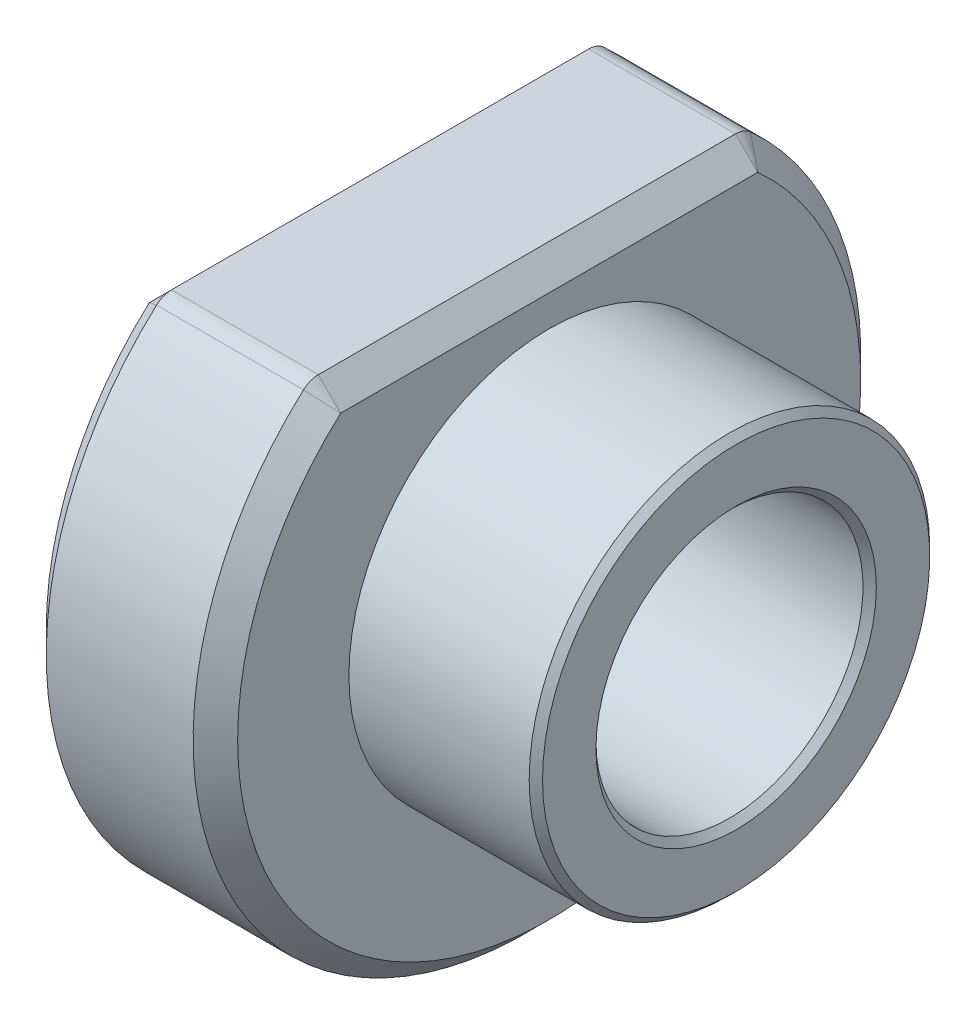
ISO-10303-21;
HEADER;
FILE_DESCRIPTION(('STEP AP214'),'2;1');
FILE_NAME('part.step','',(''),(''),'','','');
FILE_SCHEMA(('AUTOMOTIVE_DESIGN { 1 0 10303 214 1 1 1 1 }'));
ENDSEC;
DATA;
#1=APPLICATION_CONTEXT('core data for automotive mechanical design processes');
#2=APPLICATION_PROTOCOL_DEFINITION('international standard','automotive_design',2000,#1);
#3=PRODUCT_CONTEXT('',#1,'mechanical');
#4=PRODUCT('Part','Part','',(#3));
#5=PRODUCT_RELATED_PRODUCT_CATEGORY('part','',(#4));
#6=PRODUCT_DEFINITION_FORMATION('','',#4);
#7=PRODUCT_DEFINITION_CONTEXT('part definition',#1,'design');
#8=PRODUCT_DEFINITION('design','',#6,#7);
#9=PRODUCT_DEFINITION_SHAPE('','',#8);
#10=(LENGTH_UNIT() NAMED_UNIT(*) SI_UNIT(.MILLI.,.METRE.));
#11=(NAMED_UNIT(*) PLANE_ANGLE_UNIT() SI_UNIT($,.RADIAN.));
#12=(NAMED_UNIT(*) SI_UNIT($,.STERADIAN.) SOLID_ANGLE_UNIT());
#13=UNCERTAINTY_MEASURE_WITH_UNIT(LENGTH_MEASURE(1.E-05),#10,'distance_accuracy_value','');
#14=(GEOMETRIC_REPRESENTATION_CONTEXT(3) GLOBAL_UNCERTAINTY_ASSIGNED_CONTEXT((#13)) GLOBAL_UNIT_ASSIGNED_CONTEXT((#10,
#11,#12)) REPRESENTATION_CONTEXT('',''));
#15=CARTESIAN_POINT('',(0.,0.,0.));
#16=DIRECTION('',(0.,0.,1.));
#17=DIRECTION('',(1.,0.,0.));
#18=AXIS2_PLACEMENT_3D('',#15,#16,#17);
#19=CARTESIAN_POINT('',(0.,0.,0.));
#20=DIRECTION('',(-1.,0.,0.));
#21=DIRECTION('',(0.,0.,1.));
#22=AXIS2_PLACEMENT_3D('',#19,#20,#21);
#23=CYLINDRICAL_SURFACE('',#22,30.);
#24=CARTESIAN_POINT('',(2.00000000000003,0.,0.));
#25=DIRECTION('',(1.,0.,0.));
#26=DIRECTION('',(0.,1.,0.));
#27=AXIS2_PLACEMENT_3D('',#24,#25,#26);
#28=CIRCLE('',#27,30.);
#29=CARTESIAN_POINT('',(2.00000000000003,30.,0.));
#30=VERTEX_POINT('',#29);
#31=EDGE_CURVE('E42',#30,#30,#28,.F.);
#32=ORIENTED_EDGE('',*,*,#31,.T.);
#33=EDGE_LOOP('',(#32));
#34=FACE_BOUND('',#33,.T.);
#35=CARTESIAN_POINT('',(83.5000000000029,0.,0.));
#36=DIRECTION('',(-1.,0.,0.));
#37=DIRECTION('',(0.,0.,1.));
#38=AXIS2_PLACEMENT_3D('',#35,#36,#37);
#39=CIRCLE('',#38,30.);
#40=CARTESIAN_POINT('',(83.5000000000029,0.,30.));
#41=VERTEX_POINT('',#40);
#42=EDGE_CURVE('E230',#41,#41,#39,.F.);
#43=ORIENTED_EDGE('',*,*,#42,.T.);
#44=EDGE_LOOP('',(#43));
#45=FACE_BOUND('',#44,.T.);
#46=ADVANCED_FACE('F34',(#34,#45),#23,.F.);
#47=CARTESIAN_POINT('',(0.,30.0000000000002,0.));
#48=DIRECTION('',(1.,0.,0.));
#49=DIRECTION('',(0.,0.,-1.));
#50=AXIS2_PLACEMENT_3D('',#47,#48,#49);
#51=PLANE('',#50);
#52=CARTESIAN_POINT('',(0.,0.,0.));
#53=DIRECTION('',(1.,0.,0.));
#54=DIRECTION('',(0.,1.,0.));
#55=AXIS2_PLACEMENT_3D('',#52,#53,#54);
#56=CIRCLE('',#55,32.);
#57=CARTESIAN_POINT('',(0.,32.,0.));
#58=VERTEX_POINT('',#57);
#59=EDGE_CURVE('E11',#58,#58,#56,.T.);
#60=ORIENTED_EDGE('',*,*,#59,.T.);
#61=EDGE_LOOP('',(#60));
#62=FACE_BOUND('',#61,.T.);
#63=CARTESIAN_POINT('',(0.,0.,0.));
#64=DIRECTION('',(1.,0.,0.));
#65=DIRECTION('',(0.,0.,-1.));
#66=AXIS2_PLACEMENT_3D('',#63,#64,#65);
#67=CIRCLE('',#66,70.);
#68=CARTESIAN_POINT('',(0.,52.0000000000049,-46.8614980554399));
#69=VERTEX_POINT('',#68);
#70=CARTESIAN_POINT('',(0.,51.9999999999952,46.8614980554399));
#71=VERTEX_POINT('',#70);
#72=EDGE_CURVE('E48',#69,#71,#67,.F.);
#73=ORIENTED_EDGE('',*,*,#72,.T.);
#74=DIRECTION('',(0.,0.,-1.));
#75=VECTOR('',#74,1.);
#76=CARTESIAN_POINT('',(0.,52.,-1.66533453693773E-13));
#77=LINE('',#76,#75);
#78=EDGE_CURVE('E93',#71,#69,#77,.T.);
#79=ORIENTED_EDGE('',*,*,#78,.T.);
#80=EDGE_LOOP('',(#73,#79));
#81=FACE_BOUND('',#80,.T.);
#82=ADVANCED_FACE('F168',(#62,#81),#51,.F.);
#83=CARTESIAN_POINT('',(0.,0.,0.));
#84=DIRECTION('',(-1.,0.,0.));
#85=DIRECTION('',(0.,0.,1.));
#86=AXIS2_PLACEMENT_3D('',#83,#84,#85);
#87=CYLINDRICAL_SURFACE('',#86,75.);
#88=DIRECTION('',(-1.,0.,0.));
#89=VECTOR('',#88,1.);
#90=CARTESIAN_POINT('',(0.,55.7142857142856,-50.2087479165428));
#91=LINE('',#90,#89);
#92=CARTESIAN_POINT('',(5.,55.7142857142856,-50.2087479165428));
#93=VERTEX_POINT('',#92);
#94=CARTESIAN_POINT('',(37.9999999999999,55.7142857142856,-50.2087479165428));
#95=VERTEX_POINT('',#94);
#96=EDGE_CURVE('E223',#93,#95,#91,.F.);
#97=ORIENTED_EDGE('',*,*,#96,.T.);
#98=CARTESIAN_POINT('',(37.9999999999999,0.,0.));
#99=DIRECTION('',(-1.,0.,0.));
#100=DIRECTION('',(0.,0.,1.));
#101=AXIS2_PLACEMENT_3D('',#98,#99,#100);
#102=CIRCLE('',#101,75.);
#103=CARTESIAN_POINT('',(37.9999999999999,55.714285714286,50.2087479165428));
#104=VERTEX_POINT('',#103);
#105=EDGE_CURVE('E137',#95,#104,#102,.T.);
#106=ORIENTED_EDGE('',*,*,#105,.T.);
#107=DIRECTION('',(-1.,0.,0.));
#108=VECTOR('',#107,1.);
#109=CARTESIAN_POINT('',(0.,55.714285714286,50.2087479165428));
#110=LINE('',#109,#108);
#111=CARTESIAN_POINT('',(5.,55.714285714286,50.2087479165428));
#112=VERTEX_POINT('',#111);
#113=EDGE_CURVE('E121',#104,#112,#110,.T.);
#114=ORIENTED_EDGE('',*,*,#113,.T.);
#115=CARTESIAN_POINT('',(5.,0.,0.));
#116=DIRECTION('',(1.,0.,0.));
#117=DIRECTION('',(0.,0.,-1.));
#118=AXIS2_PLACEMENT_3D('',#115,#116,#117);
#119=CIRCLE('',#118,75.);
#120=EDGE_CURVE('E135',#112,#93,#119,.T.);
#121=ORIENTED_EDGE('',*,*,#120,.T.);
#122=EDGE_LOOP('',(#97,#106,#114,#121));
#123=FACE_BOUND('',#122,.T.);
#124=ADVANCED_FACE('F173',(#123),#87,.T.);
#125=CARTESIAN_POINT('',(42.9999999999999,75.0000000000002,0.));
#126=DIRECTION('',(-1.,0.,0.));
#127=DIRECTION('',(0.,0.,1.));
#128=AXIS2_PLACEMENT_3D('',#125,#126,#127);
#129=PLANE('',#128);
#130=CARTESIAN_POINT('',(42.9999999999999,0.,1.66533453693773E-13));
#131=DIRECTION('',(-1.,0.,0.));
#132=DIRECTION('',(0.,0.,1.));
#133=AXIS2_PLACEMENT_3D('',#130,#131,#132);
#134=CIRCLE('',#133,70.);
#135=CARTESIAN_POINT('',(42.9999999999999,51.9999999999952,46.8614980554398));
#136=VERTEX_POINT('',#135);
#137=CARTESIAN_POINT('',(42.9999999999999,52.0000000000045,-46.8614980554399));
#138=VERTEX_POINT('',#137);
#139=EDGE_CURVE('E126',#136,#138,#134,.F.);
#140=ORIENTED_EDGE('',*,*,#139,.T.);
#141=DIRECTION('',(0.,0.,1.));
#142=VECTOR('',#141,1.);
#143=CARTESIAN_POINT('',(42.9999999999999,51.9999999999996,0.));
#144=LINE('',#143,#142);
#145=EDGE_CURVE('E128',#138,#136,#144,.T.);
#146=ORIENTED_EDGE('',*,*,#145,.T.);
#147=EDGE_LOOP('',(#140,#146));
#148=FACE_BOUND('',#147,.T.);
#149=CARTESIAN_POINT('',(42.9999999999999,0.,1.66533453693773E-13));
#150=DIRECTION('',(-1.,0.,0.));
#151=DIRECTION('',(0.,0.,1.));
#152=AXIS2_PLACEMENT_3D('',#149,#150,#151);
#153=CIRCLE('',#152,45.);
#154=CARTESIAN_POINT('',(42.9999999999999,0.,45.0000000000002));
#155=VERTEX_POINT('',#154);
#156=EDGE_CURVE('E151',#155,#155,#153,.T.);
#157=ORIENTED_EDGE('',*,*,#156,.T.);
#158=EDGE_LOOP('',(#157));
#159=FACE_BOUND('',#158,.T.);
#160=ADVANCED_FACE('F244',(#148,#159),#129,.F.);
#161=CARTESIAN_POINT('',(0.,0.,0.));
#162=DIRECTION('',(-1.,0.,0.));
#163=DIRECTION('',(0.,0.,1.));
#164=AXIS2_PLACEMENT_3D('',#161,#162,#163);
#165=CYLINDRICAL_SURFACE('',#164,45.);
#166=CARTESIAN_POINT('',(83.5000000000028,0.,0.));
#167=DIRECTION('',(-1.,0.,0.));
#168=DIRECTION('',(0.,0.,1.));
#169=AXIS2_PLACEMENT_3D('',#166,#167,#168);
#170=CIRCLE('',#169,45.);
#171=CARTESIAN_POINT('',(83.5000000000028,0.,45.));
#172=VERTEX_POINT('',#171);
#173=EDGE_CURVE('E227',#172,#172,#170,.T.);
#174=ORIENTED_EDGE('',*,*,#173,.T.);
#175=EDGE_LOOP('',(#174));
#176=FACE_BOUND('',#175,.T.);
#177=ORIENTED_EDGE('',*,*,#156,.F.);
#178=EDGE_LOOP('',(#177));
#179=FACE_BOUND('',#178,.T.);
#180=ADVANCED_FACE('F246',(#176,#179),#165,.T.);
#181=CARTESIAN_POINT('',(85.0000000000029,44.9999999999999,0.));
#182=DIRECTION('',(-1.,0.,0.));
#183=DIRECTION('',(0.,0.,1.));
#184=AXIS2_PLACEMENT_3D('',#181,#182,#183);
#185=PLANE('',#184);
#186=CARTESIAN_POINT('',(85.0000000000029,0.,0.));
#187=DIRECTION('',(-1.,0.,0.));
#188=DIRECTION('',(0.,0.,1.));
#189=AXIS2_PLACEMENT_3D('',#186,#187,#188);
#190=CIRCLE('',#189,31.5);
#191=CARTESIAN_POINT('',(85.0000000000029,0.,31.5));
#192=VERTEX_POINT('',#191);
#193=EDGE_CURVE('E235',#192,#192,#190,.T.);
#194=ORIENTED_EDGE('',*,*,#193,.T.);
#195=EDGE_LOOP('',(#194));
#196=FACE_BOUND('',#195,.T.);
#197=CARTESIAN_POINT('',(85.0000000000029,0.,0.));
#198=DIRECTION('',(-1.,0.,0.));
#199=DIRECTION('',(0.,0.,1.));
#200=AXIS2_PLACEMENT_3D('',#197,#198,#199);
#201=CIRCLE('',#200,43.5);
#202=CARTESIAN_POINT('',(85.0000000000029,0.,43.5));
#203=VERTEX_POINT('',#202);
#204=EDGE_CURVE('E238',#203,#203,#201,.F.);
#205=ORIENTED_EDGE('',*,*,#204,.T.);
#206=EDGE_LOOP('',(#205));
#207=FACE_BOUND('',#206,.T.);
#208=ADVANCED_FACE('F248',(#196,#207),#185,.F.);
#209=CARTESIAN_POINT('',(85.0010000000029,56.9999999999999,-48.7442304278159));
#210=DIRECTION('',(0.,-1.,0.));
#211=DIRECTION('',(0.,0.,-1.));
#212=AXIS2_PLACEMENT_3D('',#209,#210,#211);
#213=PLANE('',#212);
#214=DIRECTION('',(-1.,0.,0.));
#215=VECTOR('',#214,1.);
#216=CARTESIAN_POINT('',(85.0010000000029,56.9999999999955,46.8614980554399));
#217=LINE('',#216,#215);
#218=CARTESIAN_POINT('',(5.,56.9999999999951,46.8614980554399));
#219=VERTEX_POINT('',#218);
#220=CARTESIAN_POINT('',(37.9999999999999,56.9999999999951,46.8614980554399));
#221=VERTEX_POINT('',#220);
#222=EDGE_CURVE('E112',#219,#221,#217,.F.);
#223=ORIENTED_EDGE('',*,*,#222,.T.);
#224=DIRECTION('',(0.,0.,-1.));
#225=VECTOR('',#224,1.);
#226=CARTESIAN_POINT('',(37.9999999999999,57.0000000000048,-48.7442304278158));
#227=LINE('',#226,#225);
#228=CARTESIAN_POINT('',(37.9999999999999,57.0000000000048,-46.8614980554399));
#229=VERTEX_POINT('',#228);
#230=EDGE_CURVE('E116',#221,#229,#227,.T.);
#231=ORIENTED_EDGE('',*,*,#230,.T.);
#232=DIRECTION('',(-1.,0.,0.));
#233=VECTOR('',#232,1.);
#234=CARTESIAN_POINT('',(85.0010000000029,56.9999999999999,-46.8614980554399));
#235=LINE('',#234,#233);
#236=CARTESIAN_POINT('',(5.,57.0000000000048,-46.8614980554399));
#237=VERTEX_POINT('',#236);
#238=EDGE_CURVE('E115',#229,#237,#235,.T.);
#239=ORIENTED_EDGE('',*,*,#238,.T.);
#240=DIRECTION('',(0.,0.,1.));
#241=VECTOR('',#240,1.);
#242=CARTESIAN_POINT('',(5.,57.0000000000048,-48.7442304278158));
#243=LINE('',#242,#241);
#244=EDGE_CURVE('E92',#237,#219,#243,.T.);
#245=ORIENTED_EDGE('',*,*,#244,.T.);
#246=EDGE_LOOP('',(#223,#231,#239,#245));
#247=FACE_BOUND('',#246,.T.);
#248=ADVANCED_FACE('F110',(#247),#213,.F.);
#249=CARTESIAN_POINT('',(85.0000000000029,0.,0.));
#250=DIRECTION('',(1.,0.,0.));
#251=DIRECTION('',(0.,0.,-1.));
#252=AXIS2_PLACEMENT_3D('',#249,#250,#251);
#253=CONICAL_SURFACE('',#252,31.5,0.785398163397455);
#254=ORIENTED_EDGE('',*,*,#42,.F.);
#255=EDGE_LOOP('',(#254));
#256=FACE_BOUND('',#255,.T.);
#257=ORIENTED_EDGE('',*,*,#193,.F.);
#258=EDGE_LOOP('',(#257));
#259=FACE_BOUND('',#258,.T.);
#260=ADVANCED_FACE('F178',(#256,#259),#253,.F.);
#261=CARTESIAN_POINT('',(83.5000000000028,0.,0.));
#262=DIRECTION('',(-1.,0.,0.));
#263=DIRECTION('',(0.,0.,1.));
#264=AXIS2_PLACEMENT_3D('',#261,#262,#263);
#265=CONICAL_SURFACE('',#264,45.,0.785398163397444);
#266=ORIENTED_EDGE('',*,*,#204,.F.);
#267=EDGE_LOOP('',(#266));
#268=FACE_BOUND('',#267,.T.);
#269=ORIENTED_EDGE('',*,*,#173,.F.);
#270=EDGE_LOOP('',(#269));
#271=FACE_BOUND('',#270,.T.);
#272=ADVANCED_FACE('F181',(#268,#271),#265,.T.);
#273=CARTESIAN_POINT('',(0.,51.9999999999952,46.8614980554399));
#274=DIRECTION('',(-1.,0.,0.));
#275=DIRECTION('',(0.,0.,1.));
#276=AXIS2_PLACEMENT_3D('',#273,#274,#275);
#277=CYLINDRICAL_SURFACE('',#276,5.);
#278=ORIENTED_EDGE('',*,*,#113,.F.);
#279=CARTESIAN_POINT('',(37.9999999999999,51.9999999999952,46.8614980554399));
#280=DIRECTION('',(-1.,0.,0.));
#281=DIRECTION('',(0.,0.,1.));
#282=AXIS2_PLACEMENT_3D('',#279,#280,#281);
#283=CIRCLE('',#282,5.);
#284=EDGE_CURVE('E104',#104,#221,#283,.T.);
#285=ORIENTED_EDGE('',*,*,#284,.T.);
#286=ORIENTED_EDGE('',*,*,#222,.F.);
#287=CARTESIAN_POINT('',(5.,51.9999999999952,46.8614980554399));
#288=DIRECTION('',(1.,0.,0.));
#289=DIRECTION('',(0.,0.,-1.));
#290=AXIS2_PLACEMENT_3D('',#287,#288,#289);
#291=CIRCLE('',#290,5.);
#292=EDGE_CURVE('E97',#219,#112,#291,.T.);
#293=ORIENTED_EDGE('',*,*,#292,.T.);
#294=EDGE_LOOP('',(#278,#285,#286,#293));
#295=FACE_BOUND('',#294,.T.);
#296=ADVANCED_FACE('F118',(#295),#277,.T.);
#297=CARTESIAN_POINT('',(0.,52.0000000000049,-46.8614980554399));
#298=DIRECTION('',(-1.,0.,0.));
#299=DIRECTION('',(0.,0.,1.));
#300=AXIS2_PLACEMENT_3D('',#297,#298,#299);
#301=CYLINDRICAL_SURFACE('',#300,5.);
#302=ORIENTED_EDGE('',*,*,#238,.F.);
#303=CARTESIAN_POINT('',(37.9999999999999,52.0000000000049,-46.8614980554399));
#304=DIRECTION('',(-1.,0.,0.));
#305=DIRECTION('',(0.,0.,1.));
#306=AXIS2_PLACEMENT_3D('',#303,#304,#305);
#307=CIRCLE('',#306,5.);
#308=EDGE_CURVE('E105',#229,#95,#307,.T.);
#309=ORIENTED_EDGE('',*,*,#308,.T.);
#310=ORIENTED_EDGE('',*,*,#96,.F.);
#311=CARTESIAN_POINT('',(5.,52.0000000000049,-46.8614980554399));
#312=DIRECTION('',(1.,0.,0.));
#313=DIRECTION('',(0.,0.,-1.));
#314=AXIS2_PLACEMENT_3D('',#311,#312,#313);
#315=CIRCLE('',#314,5.);
#316=EDGE_CURVE('E131',#93,#237,#315,.T.);
#317=ORIENTED_EDGE('',*,*,#316,.T.);
#318=EDGE_LOOP('',(#302,#309,#310,#317));
#319=FACE_BOUND('',#318,.T.);
#320=ADVANCED_FACE('F188',(#319),#301,.T.);
#321=CARTESIAN_POINT('',(37.9999999999999,0.,0.));
#322=DIRECTION('',(-1.,0.,0.));
#323=DIRECTION('',(0.,0.,1.));
#324=AXIS2_PLACEMENT_3D('',#321,#322,#323);
#325=CONICAL_SURFACE('',#324,75.,0.78539816339745);
#326=DIRECTION('',(0.707106781186546,-0.52527932316715,-0.473372615022312));
#327=VECTOR('',#326,1.);
#328=CARTESIAN_POINT('',(37.9999999999999,55.714285714286,50.2087479165428));
#329=LINE('',#328,#327);
#330=EDGE_CURVE('E149',#104,#136,#329,.T.);
#331=ORIENTED_EDGE('',*,*,#330,.F.);
#332=ORIENTED_EDGE('',*,*,#105,.F.);
#333=DIRECTION('',(-0.707106781186546,0.52527932316715,-0.473372615022312));
#334=VECTOR('',#333,1.);
#335=CARTESIAN_POINT('',(42.9999999999999,52.0000000000045,-46.8614980554399));
#336=LINE('',#335,#334);
#337=EDGE_CURVE('E146',#138,#95,#336,.T.);
#338=ORIENTED_EDGE('',*,*,#337,.F.);
#339=ORIENTED_EDGE('',*,*,#139,.F.);
#340=EDGE_LOOP('',(#331,#332,#338,#339));
#341=FACE_BOUND('',#340,.T.);
#342=ADVANCED_FACE('F191',(#341),#325,.T.);
#343=CARTESIAN_POINT('',(37.9999999999999,51.9999999999952,46.8614980554399));
#344=DIRECTION('',(-1.,0.,0.));
#345=DIRECTION('',(0.,0.,1.));
#346=AXIS2_PLACEMENT_3D('',#343,#344,#345);
#347=CONICAL_SURFACE('',#346,5.00000000000003,0.78539816339745);
#348=ORIENTED_EDGE('',*,*,#284,.F.);
#349=ORIENTED_EDGE('',*,*,#330,.T.);
#350=DIRECTION('',(0.707106781186546,-0.707106781186548,0.));
#351=VECTOR('',#350,1.);
#352=CARTESIAN_POINT('',(37.9999999999999,56.9999999999951,46.8614980554399));
#353=LINE('',#352,#351);
#354=EDGE_CURVE('E143',#221,#136,#353,.T.);
#355=ORIENTED_EDGE('',*,*,#354,.F.);
#356=EDGE_LOOP('',(#348,#349,#355));
#357=FACE_BOUND('',#356,.T.);
#358=ADVANCED_FACE('F201',(#357),#347,.T.);
#359=CARTESIAN_POINT('',(37.9999999999999,52.0000000000049,-46.8614980554399));
#360=DIRECTION('',(-1.,0.,0.));
#361=DIRECTION('',(0.,0.,1.));
#362=AXIS2_PLACEMENT_3D('',#359,#360,#361);
#363=CONICAL_SURFACE('',#362,5.00000000000003,0.78539816339745);
#364=ORIENTED_EDGE('',*,*,#337,.T.);
#365=ORIENTED_EDGE('',*,*,#308,.F.);
#366=DIRECTION('',(-0.707106781186546,0.707106781186548,0.));
#367=VECTOR('',#366,1.);
#368=CARTESIAN_POINT('',(42.9999999999999,52.0000000000045,-46.8614980554399));
#369=LINE('',#368,#367);
#370=EDGE_CURVE('E141',#138,#229,#369,.T.);
#371=ORIENTED_EDGE('',*,*,#370,.F.);
#372=EDGE_LOOP('',(#364,#365,#371));
#373=FACE_BOUND('',#372,.T.);
#374=ADVANCED_FACE('F197',(#373),#363,.T.);
#375=CARTESIAN_POINT('',(37.9999999999999,57.0000000000048,-48.7442304278158));
#376=DIRECTION('',(-0.707106781186548,-0.707106781186546,0.));
#377=DIRECTION('',(0.,0.,-1.));
#378=AXIS2_PLACEMENT_3D('',#375,#376,#377);
#379=PLANE('',#378);
#380=ORIENTED_EDGE('',*,*,#354,.T.);
#381=ORIENTED_EDGE('',*,*,#145,.F.);
#382=ORIENTED_EDGE('',*,*,#370,.T.);
#383=ORIENTED_EDGE('',*,*,#230,.F.);
#384=EDGE_LOOP('',(#380,#381,#382,#383));
#385=FACE_BOUND('',#384,.T.);
#386=ADVANCED_FACE('F193',(#385),#379,.F.);
#387=CARTESIAN_POINT('',(0.,0.,0.));
#388=DIRECTION('',(1.,0.,0.));
#389=DIRECTION('',(0.,0.,-1.));
#390=AXIS2_PLACEMENT_3D('',#387,#388,#389);
#391=CONICAL_SURFACE('',#390,70.,0.785398163397446);
#392=DIRECTION('',(-0.70710678118655,-0.525279323167149,0.473372615022312));
#393=VECTOR('',#392,1.);
#394=CARTESIAN_POINT('',(5.,55.7142857142856,-50.2087479165427));
#395=LINE('',#394,#393);
#396=EDGE_CURVE('E144',#93,#69,#395,.T.);
#397=ORIENTED_EDGE('',*,*,#396,.F.);
#398=ORIENTED_EDGE('',*,*,#120,.F.);
#399=DIRECTION('',(0.70710678118655,0.525279323167148,0.473372615022306));
#400=VECTOR('',#399,1.);
#401=CARTESIAN_POINT('',(0.,51.9999999999952,46.8614980554399));
#402=LINE('',#401,#400);
#403=EDGE_CURVE('E99',#71,#112,#402,.T.);
#404=ORIENTED_EDGE('',*,*,#403,.F.);
#405=ORIENTED_EDGE('',*,*,#72,.F.);
#406=EDGE_LOOP('',(#397,#398,#404,#405));
#407=FACE_BOUND('',#406,.T.);
#408=ADVANCED_FACE('F196',(#407),#391,.T.);
#409=CARTESIAN_POINT('',(5.,52.0000000000049,-46.8614980554399));
#410=DIRECTION('',(1.,0.,0.));
#411=DIRECTION('',(0.,0.,-1.));
#412=AXIS2_PLACEMENT_3D('',#409,#410,#411);
#413=CONICAL_SURFACE('',#412,4.99999999999999,0.785398163397446);
#414=ORIENTED_EDGE('',*,*,#316,.F.);
#415=ORIENTED_EDGE('',*,*,#396,.T.);
#416=DIRECTION('',(-0.707106781186549,-0.707106781186545,0.));
#417=VECTOR('',#416,1.);
#418=CARTESIAN_POINT('',(5.,57.0000000000048,-46.8614980554399));
#419=LINE('',#418,#417);
#420=EDGE_CURVE('E56',#237,#69,#419,.T.);
#421=ORIENTED_EDGE('',*,*,#420,.F.);
#422=EDGE_LOOP('',(#414,#415,#421));
#423=FACE_BOUND('',#422,.T.);
#424=ADVANCED_FACE('F211',(#423),#413,.T.);
#425=CARTESIAN_POINT('',(5.,51.9999999999952,46.8614980554399));
#426=DIRECTION('',(1.,0.,0.));
#427=DIRECTION('',(0.,0.,-1.));
#428=AXIS2_PLACEMENT_3D('',#425,#426,#427);
#429=CONICAL_SURFACE('',#428,4.99999999999999,0.785398163397446);
#430=ORIENTED_EDGE('',*,*,#403,.T.);
#431=ORIENTED_EDGE('',*,*,#292,.F.);
#432=DIRECTION('',(0.707106781186549,0.707106781186545,0.));
#433=VECTOR('',#432,1.);
#434=CARTESIAN_POINT('',(0.,51.9999999999952,46.8614980554399));
#435=LINE('',#434,#433);
#436=EDGE_CURVE('E88',#71,#219,#435,.T.);
#437=ORIENTED_EDGE('',*,*,#436,.F.);
#438=EDGE_LOOP('',(#430,#431,#437));
#439=FACE_BOUND('',#438,.T.);
#440=ADVANCED_FACE('F98',(#439),#429,.T.);
#441=CARTESIAN_POINT('',(5.,57.0000000000048,-48.7442304278158));
#442=DIRECTION('',(0.707106781186545,-0.707106781186549,0.));
#443=DIRECTION('',(0.,0.,1.));
#444=AXIS2_PLACEMENT_3D('',#441,#442,#443);
#445=PLANE('',#444);
#446=ORIENTED_EDGE('',*,*,#420,.T.);
#447=ORIENTED_EDGE('',*,*,#78,.F.);
#448=ORIENTED_EDGE('',*,*,#436,.T.);
#449=ORIENTED_EDGE('',*,*,#244,.F.);
#450=EDGE_LOOP('',(#446,#447,#448,#449));
#451=FACE_BOUND('',#450,.T.);
#452=ADVANCED_FACE('F90',(#451),#445,.F.);
#453=CARTESIAN_POINT('',(2.00000000000003,0.,0.));
#454=DIRECTION('',(-1.,0.,0.));
#455=DIRECTION('',(0.,-1.,0.));
#456=AXIS2_PLACEMENT_3D('',#453,#454,#455);
#457=CONICAL_SURFACE('',#456,30.,0.785398163397449);
#458=ORIENTED_EDGE('',*,*,#59,.F.);
#459=EDGE_LOOP('',(#458));
#460=FACE_BOUND('',#459,.T.);
#461=ORIENTED_EDGE('',*,*,#31,.F.);
#462=EDGE_LOOP('',(#461));
#463=FACE_BOUND('',#462,.T.);
#464=ADVANCED_FACE('F36',(#460,#463),#457,.F.);
#465=CLOSED_SHELL('',(#46,#82,#124,#160,#180,#208,#248,#260,#272,#296,#320,#342,#358,#374,#386,
#408,#424,#440,#452,#464));
#466=MANIFOLD_SOLID_BREP('B2',#465);
#467=ADVANCED_BREP_SHAPE_REPRESENTATION('',(#18,#466),#14);
#468=SHAPE_DEFINITION_REPRESENTATION(#9,#467);
ENDSEC;
END-ISO-10303-21;
